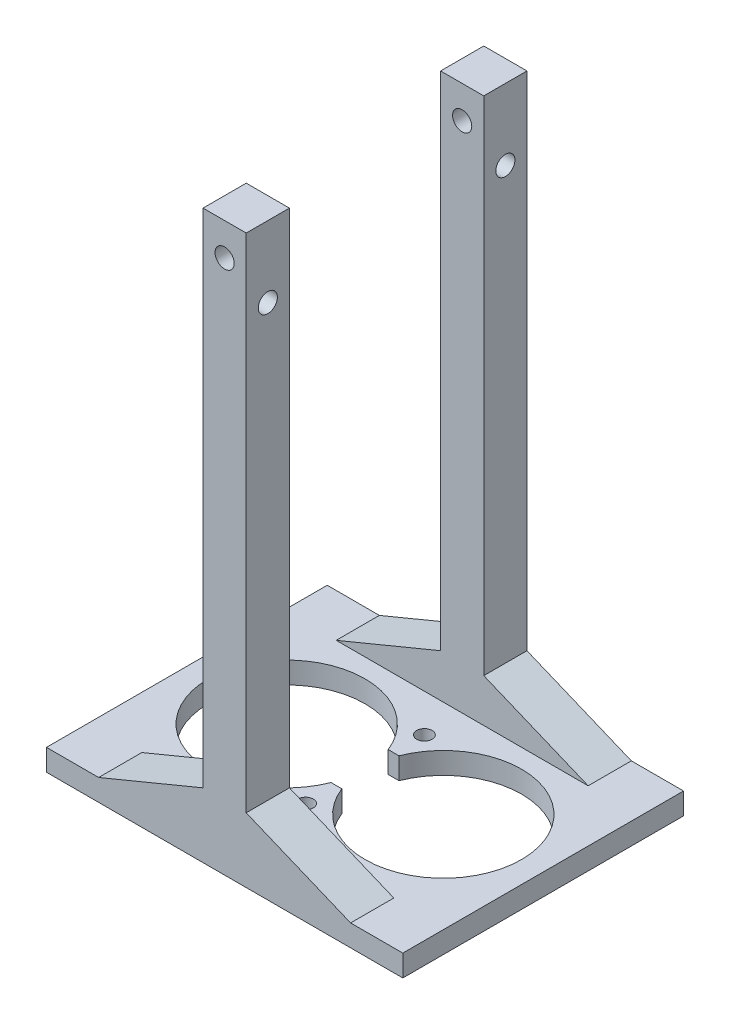
ISO-10303-21;
HEADER;
FILE_DESCRIPTION(('STEP AP214'),'2;1');
FILE_NAME('part.step','',(''),(''),'','','');
FILE_SCHEMA(('AUTOMOTIVE_DESIGN { 1 0 10303 214 1 1 1 1 }'));
ENDSEC;
DATA;
#1=APPLICATION_CONTEXT('core data for automotive mechanical design processes');
#2=APPLICATION_PROTOCOL_DEFINITION('international standard','automotive_design',2000,#1);
#3=PRODUCT_CONTEXT('',#1,'mechanical');
#4=PRODUCT('Part','Part','',(#3));
#5=PRODUCT_RELATED_PRODUCT_CATEGORY('part','',(#4));
#6=PRODUCT_DEFINITION_FORMATION('','',#4);
#7=PRODUCT_DEFINITION_CONTEXT('part definition',#1,'design');
#8=PRODUCT_DEFINITION('design','',#6,#7);
#9=PRODUCT_DEFINITION_SHAPE('','',#8);
#10=(LENGTH_UNIT() NAMED_UNIT(*) SI_UNIT(.MILLI.,.METRE.));
#11=(NAMED_UNIT(*) PLANE_ANGLE_UNIT() SI_UNIT($,.RADIAN.));
#12=(NAMED_UNIT(*) SI_UNIT($,.STERADIAN.) SOLID_ANGLE_UNIT());
#13=UNCERTAINTY_MEASURE_WITH_UNIT(LENGTH_MEASURE(1.E-05),#10,'distance_accuracy_value','');
#14=(GEOMETRIC_REPRESENTATION_CONTEXT(3) GLOBAL_UNCERTAINTY_ASSIGNED_CONTEXT((#13)) GLOBAL_UNIT_ASSIGNED_CONTEXT((#10,
#11,#12)) REPRESENTATION_CONTEXT('',''));
#15=CARTESIAN_POINT('',(0.,0.,0.));
#16=DIRECTION('',(0.,0.,1.));
#17=DIRECTION('',(1.,0.,0.));
#18=AXIS2_PLACEMENT_3D('',#15,#16,#17);
#19=CARTESIAN_POINT('',(-25.9246342106268,105.,-8.44546224874153));
#20=DIRECTION('',(-1.,0.,0.));
#21=DIRECTION('',(0.,0.,1.));
#22=AXIS2_PLACEMENT_3D('',#19,#20,#21);
#23=PLANE('',#22);
#24=CARTESIAN_POINT('',(-25.9246342106268,91.8394942984958,-12.4454622487415));
#25=DIRECTION('',(-1.,0.,0.));
#26=DIRECTION('',(0.,0.,1.));
#27=AXIS2_PLACEMENT_3D('',#24,#25,#26);
#28=CIRCLE('',#27,1.775);
#29=CARTESIAN_POINT('',(-25.9246342106268,91.8394942984958,-10.6704622487415));
#30=VERTEX_POINT('',#29);
#31=EDGE_CURVE('E246',#30,#30,#28,.T.);
#32=ORIENTED_EDGE('',*,*,#31,.F.);
#33=EDGE_LOOP('',(#32));
#34=FACE_BOUND('',#33,.T.);
#35=DIRECTION('',(0.,-1.,0.));
#36=VECTOR('',#35,1.);
#37=CARTESIAN_POINT('',(-25.9246342106268,105.,-16.4454622487415));
#38=LINE('',#37,#36);
#39=CARTESIAN_POINT('',(-25.9246342106268,105.,-16.4454622487415));
#40=VERTEX_POINT('',#39);
#41=CARTESIAN_POINT('',(-25.9246342106268,12.,-16.4454622487415));
#42=VERTEX_POINT('',#41);
#43=EDGE_CURVE('E306',#40,#42,#38,.T.);
#44=ORIENTED_EDGE('',*,*,#43,.T.);
#45=DIRECTION('',(0.,0.,1.));
#46=VECTOR('',#45,1.);
#47=CARTESIAN_POINT('',(-25.9246342106268,12.,-47.830171901692));
#48=LINE('',#47,#46);
#49=CARTESIAN_POINT('',(-25.9246342106268,12.,-8.44546224874153));
#50=VERTEX_POINT('',#49);
#51=EDGE_CURVE('E57',#42,#50,#48,.T.);
#52=ORIENTED_EDGE('',*,*,#51,.T.);
#53=DIRECTION('',(0.,-1.,0.));
#54=VECTOR('',#53,1.);
#55=CARTESIAN_POINT('',(-25.9246342106268,105.,-8.44546224874153));
#56=LINE('',#55,#54);
#57=CARTESIAN_POINT('',(-25.9246342106268,105.,-8.44546224874153));
#58=VERTEX_POINT('',#57);
#59=EDGE_CURVE('E309',#58,#50,#56,.T.);
#60=ORIENTED_EDGE('',*,*,#59,.F.);
#61=DIRECTION('',(0.,0.,-1.));
#62=VECTOR('',#61,1.);
#63=CARTESIAN_POINT('',(-25.9246342106268,105.,-8.44546224874153));
#64=LINE('',#63,#62);
#65=EDGE_CURVE('E294',#58,#40,#64,.T.);
#66=ORIENTED_EDGE('',*,*,#65,.T.);
#67=EDGE_LOOP('',(#44,#52,#60,#66));
#68=FACE_BOUND('',#67,.T.);
#69=ADVANCED_FACE('F34',(#34,#68),#23,.T.);
#70=CARTESIAN_POINT('',(-17.9246342106268,105.,-8.44546224874153));
#71=DIRECTION('',(1.,0.,0.));
#72=DIRECTION('',(0.,0.,-1.));
#73=AXIS2_PLACEMENT_3D('',#70,#71,#72);
#74=PLANE('',#73);
#75=CARTESIAN_POINT('',(-17.9246342106268,91.8394942984958,-12.4454622487415));
#76=DIRECTION('',(1.,0.,0.));
#77=DIRECTION('',(0.,0.,-1.));
#78=AXIS2_PLACEMENT_3D('',#75,#76,#77);
#79=CIRCLE('',#78,1.775);
#80=CARTESIAN_POINT('',(-17.9246342106268,91.8394942984958,-14.2204622487415));
#81=VERTEX_POINT('',#80);
#82=EDGE_CURVE('E234',#81,#81,#79,.T.);
#83=ORIENTED_EDGE('',*,*,#82,.F.);
#84=EDGE_LOOP('',(#83));
#85=FACE_BOUND('',#84,.T.);
#86=DIRECTION('',(0.,-1.,0.));
#87=VECTOR('',#86,1.);
#88=CARTESIAN_POINT('',(-17.9246342106268,105.,-8.44546224874153));
#89=LINE('',#88,#87);
#90=CARTESIAN_POINT('',(-17.9246342106268,105.,-8.44546224874153));
#91=VERTEX_POINT('',#90);
#92=CARTESIAN_POINT('',(-17.9246342106268,12.,-8.44546224874153));
#93=VERTEX_POINT('',#92);
#94=EDGE_CURVE('E312',#91,#93,#89,.T.);
#95=ORIENTED_EDGE('',*,*,#94,.T.);
#96=DIRECTION('',(0.,0.,1.));
#97=VECTOR('',#96,1.);
#98=CARTESIAN_POINT('',(-17.9246342106268,12.,-47.830171901692));
#99=LINE('',#98,#97);
#100=CARTESIAN_POINT('',(-17.9246342106268,12.,-16.4454622487415));
#101=VERTEX_POINT('',#100);
#102=EDGE_CURVE('E188',#101,#93,#99,.T.);
#103=ORIENTED_EDGE('',*,*,#102,.F.);
#104=DIRECTION('',(0.,-1.,0.));
#105=VECTOR('',#104,1.);
#106=CARTESIAN_POINT('',(-17.9246342106268,105.,-16.4454622487415));
#107=LINE('',#106,#105);
#108=CARTESIAN_POINT('',(-17.9246342106268,105.,-16.4454622487415));
#109=VERTEX_POINT('',#108);
#110=EDGE_CURVE('E315',#109,#101,#107,.T.);
#111=ORIENTED_EDGE('',*,*,#110,.F.);
#112=DIRECTION('',(0.,0.,1.));
#113=VECTOR('',#112,1.);
#114=CARTESIAN_POINT('',(-17.9246342106268,105.,-8.44546224874153));
#115=LINE('',#114,#113);
#116=EDGE_CURVE('E300',#109,#91,#115,.T.);
#117=ORIENTED_EDGE('',*,*,#116,.T.);
#118=EDGE_LOOP('',(#95,#103,#111,#117));
#119=FACE_BOUND('',#118,.T.);
#120=ADVANCED_FACE('F396',(#85,#119),#74,.T.);
#121=CARTESIAN_POINT('',(-17.9246342106268,105.,27.5545377512585));
#122=DIRECTION('',(1.,0.,0.));
#123=DIRECTION('',(0.,0.,-1.));
#124=AXIS2_PLACEMENT_3D('',#121,#122,#123);
#125=PLANE('',#124);
#126=CARTESIAN_POINT('',(-17.9246342106268,91.8394942984958,31.5545377512585));
#127=DIRECTION('',(1.,0.,0.));
#128=DIRECTION('',(0.,0.,-1.));
#129=AXIS2_PLACEMENT_3D('',#126,#127,#128);
#130=CIRCLE('',#129,1.775);
#131=CARTESIAN_POINT('',(-17.9246342106268,91.8394942984958,29.7795377512585));
#132=VERTEX_POINT('',#131);
#133=EDGE_CURVE('E249',#132,#132,#130,.T.);
#134=ORIENTED_EDGE('',*,*,#133,.F.);
#135=EDGE_LOOP('',(#134));
#136=FACE_BOUND('',#135,.T.);
#137=DIRECTION('',(0.,-1.,0.));
#138=VECTOR('',#137,1.);
#139=CARTESIAN_POINT('',(-17.9246342106268,105.,35.5545377512585));
#140=LINE('',#139,#138);
#141=CARTESIAN_POINT('',(-17.9246342106268,105.,35.5545377512585));
#142=VERTEX_POINT('',#141);
#143=CARTESIAN_POINT('',(-17.9246342106268,12.,35.5545377512585));
#144=VERTEX_POINT('',#143);
#145=EDGE_CURVE('E287',#142,#144,#140,.T.);
#146=ORIENTED_EDGE('',*,*,#145,.T.);
#147=DIRECTION('',(0.,0.,-1.));
#148=VECTOR('',#147,1.);
#149=CARTESIAN_POINT('',(-17.9246342106268,12.,66.9392474042089));
#150=LINE('',#149,#148);
#151=CARTESIAN_POINT('',(-17.9246342106268,12.,27.5545377512585));
#152=VERTEX_POINT('',#151);
#153=EDGE_CURVE('E213',#144,#152,#150,.T.);
#154=ORIENTED_EDGE('',*,*,#153,.T.);
#155=DIRECTION('',(0.,-1.,0.));
#156=VECTOR('',#155,1.);
#157=CARTESIAN_POINT('',(-17.9246342106268,105.,27.5545377512585));
#158=LINE('',#157,#156);
#159=CARTESIAN_POINT('',(-17.9246342106268,105.,27.5545377512585));
#160=VERTEX_POINT('',#159);
#161=EDGE_CURVE('E289',#160,#152,#158,.T.);
#162=ORIENTED_EDGE('',*,*,#161,.F.);
#163=DIRECTION('',(0.,0.,1.));
#164=VECTOR('',#163,1.);
#165=CARTESIAN_POINT('',(-17.9246342106268,105.,27.5545377512585));
#166=LINE('',#165,#164);
#167=EDGE_CURVE('E274',#160,#142,#166,.T.);
#168=ORIENTED_EDGE('',*,*,#167,.T.);
#169=EDGE_LOOP('',(#146,#154,#162,#168));
#170=FACE_BOUND('',#169,.T.);
#171=ADVANCED_FACE('F402',(#136,#170),#125,.T.);
#172=CARTESIAN_POINT('',(-25.9246342106268,105.,27.5545377512585));
#173=DIRECTION('',(-1.,0.,0.));
#174=DIRECTION('',(0.,0.,1.));
#175=AXIS2_PLACEMENT_3D('',#172,#173,#174);
#176=PLANE('',#175);
#177=CARTESIAN_POINT('',(-25.9246342106268,91.8394942984958,31.5545377512585));
#178=DIRECTION('',(-1.,0.,0.));
#179=DIRECTION('',(0.,0.,1.));
#180=AXIS2_PLACEMENT_3D('',#177,#178,#179);
#181=CIRCLE('',#180,1.775);
#182=CARTESIAN_POINT('',(-25.9246342106268,91.8394942984958,33.3295377512585));
#183=VERTEX_POINT('',#182);
#184=EDGE_CURVE('E252',#183,#183,#181,.T.);
#185=ORIENTED_EDGE('',*,*,#184,.F.);
#186=EDGE_LOOP('',(#185));
#187=FACE_BOUND('',#186,.T.);
#188=DIRECTION('',(0.,-1.,0.));
#189=VECTOR('',#188,1.);
#190=CARTESIAN_POINT('',(-25.9246342106268,105.,27.5545377512585));
#191=LINE('',#190,#189);
#192=CARTESIAN_POINT('',(-25.9246342106268,105.,27.5545377512585));
#193=VERTEX_POINT('',#192);
#194=CARTESIAN_POINT('',(-25.9246342106268,12.,27.5545377512585));
#195=VERTEX_POINT('',#194);
#196=EDGE_CURVE('E280',#193,#195,#191,.T.);
#197=ORIENTED_EDGE('',*,*,#196,.T.);
#198=DIRECTION('',(0.,0.,-1.));
#199=VECTOR('',#198,1.);
#200=CARTESIAN_POINT('',(-25.9246342106268,12.,66.9392474042089));
#201=LINE('',#200,#199);
#202=CARTESIAN_POINT('',(-25.9246342106268,12.,35.5545377512585));
#203=VERTEX_POINT('',#202);
#204=EDGE_CURVE('E217',#203,#195,#201,.T.);
#205=ORIENTED_EDGE('',*,*,#204,.F.);
#206=DIRECTION('',(0.,-1.,0.));
#207=VECTOR('',#206,1.);
#208=CARTESIAN_POINT('',(-25.9246342106268,105.,35.5545377512585));
#209=LINE('',#208,#207);
#210=CARTESIAN_POINT('',(-25.9246342106268,105.,35.5545377512585));
#211=VERTEX_POINT('',#210);
#212=EDGE_CURVE('E283',#211,#203,#209,.T.);
#213=ORIENTED_EDGE('',*,*,#212,.F.);
#214=DIRECTION('',(0.,0.,-1.));
#215=VECTOR('',#214,1.);
#216=CARTESIAN_POINT('',(-25.9246342106268,105.,27.5545377512585));
#217=LINE('',#216,#215);
#218=EDGE_CURVE('E268',#211,#193,#217,.T.);
#219=ORIENTED_EDGE('',*,*,#218,.T.);
#220=EDGE_LOOP('',(#197,#205,#213,#219));
#221=FACE_BOUND('',#220,.T.);
#222=ADVANCED_FACE('F392',(#187,#221),#176,.T.);
#223=CARTESIAN_POINT('',(11.0753657893732,4.,0.));
#224=DIRECTION('',(-1.,0.,0.));
#225=DIRECTION('',(0.,0.,1.));
#226=AXIS2_PLACEMENT_3D('',#223,#224,#225);
#227=PLANE('',#226);
#228=DIRECTION('',(0.,0.,-1.));
#229=VECTOR('',#228,1.);
#230=CARTESIAN_POINT('',(11.0753657893732,0.,0.));
#231=LINE('',#230,#229);
#232=CARTESIAN_POINT('',(11.0753657893732,0.,35.5545377512585));
#233=VERTEX_POINT('',#232);
#234=CARTESIAN_POINT('',(11.0753657893732,0.,-16.4454622487415));
#235=VERTEX_POINT('',#234);
#236=EDGE_CURVE('E362',#233,#235,#231,.T.);
#237=ORIENTED_EDGE('',*,*,#236,.T.);
#238=DIRECTION('',(0.,-1.,0.));
#239=VECTOR('',#238,1.);
#240=CARTESIAN_POINT('',(11.0753657893732,0.,-16.4454622487415));
#241=LINE('',#240,#239);
#242=CARTESIAN_POINT('',(11.0753657893732,4.,-16.4454622487415));
#243=VERTEX_POINT('',#242);
#244=EDGE_CURVE('E206',#243,#235,#241,.T.);
#245=ORIENTED_EDGE('',*,*,#244,.F.);
#246=DIRECTION('',(0.,0.,-1.));
#247=VECTOR('',#246,1.);
#248=CARTESIAN_POINT('',(11.0753657893732,4.,0.));
#249=LINE('',#248,#247);
#250=CARTESIAN_POINT('',(11.0753657893732,4.,35.5545377512585));
#251=VERTEX_POINT('',#250);
#252=EDGE_CURVE('E345',#251,#243,#249,.T.);
#253=ORIENTED_EDGE('',*,*,#252,.F.);
#254=DIRECTION('',(0.,1.,0.));
#255=VECTOR('',#254,1.);
#256=CARTESIAN_POINT('',(11.0753657893732,0.,35.5545377512585));
#257=LINE('',#256,#255);
#258=EDGE_CURVE('E221',#233,#251,#257,.T.);
#259=ORIENTED_EDGE('',*,*,#258,.F.);
#260=EDGE_LOOP('',(#237,#245,#253,#259));
#261=FACE_BOUND('',#260,.T.);
#262=ADVANCED_FACE('F387',(#261),#227,.F.);
#263=CARTESIAN_POINT('',(-7.42463421062682,4.,9.55453775125847));
#264=DIRECTION('',(0.,-1.,0.));
#265=DIRECTION('',(0.,0.,-1.));
#266=AXIS2_PLACEMENT_3D('',#263,#264,#265);
#267=CYLINDRICAL_SURFACE('',#266,14.5);
#268=CARTESIAN_POINT('',(-7.42463421062682,0.,9.55453775125847));
#269=DIRECTION('',(0.,1.,0.));
#270=DIRECTION('',(0.,0.,1.));
#271=AXIS2_PLACEMENT_3D('',#268,#269,#270);
#272=CIRCLE('',#271,14.5);
#273=CARTESIAN_POINT('',(-20.9246342106268,0.,14.8460403733877));
#274=VERTEX_POINT('',#273);
#275=CARTESIAN_POINT('',(-20.9246342106268,0.,4.26303512912929));
#276=VERTEX_POINT('',#275);
#277=EDGE_CURVE('E328',#274,#276,#272,.T.);
#278=ORIENTED_EDGE('',*,*,#277,.F.);
#279=DIRECTION('',(0.,-1.,0.));
#280=VECTOR('',#279,1.);
#281=CARTESIAN_POINT('',(-20.9246342106268,4.,14.8460403733877));
#282=LINE('',#281,#280);
#283=CARTESIAN_POINT('',(-20.9246342106268,4.,14.8460403733877));
#284=VERTEX_POINT('',#283);
#285=EDGE_CURVE('E11',#284,#274,#282,.T.);
#286=ORIENTED_EDGE('',*,*,#285,.F.);
#287=CARTESIAN_POINT('',(-7.42463421062682,4.,9.55453775125847));
#288=DIRECTION('',(0.,1.,0.));
#289=DIRECTION('',(0.,0.,1.));
#290=AXIS2_PLACEMENT_3D('',#287,#288,#289);
#291=CIRCLE('',#290,14.5);
#292=CARTESIAN_POINT('',(-20.9246342106268,4.,4.26303512912929));
#293=VERTEX_POINT('',#292);
#294=EDGE_CURVE('E331',#284,#293,#291,.T.);
#295=ORIENTED_EDGE('',*,*,#294,.T.);
#296=DIRECTION('',(0.,-1.,0.));
#297=VECTOR('',#296,1.);
#298=CARTESIAN_POINT('',(-20.9246342106268,4.,4.26303512912929));
#299=LINE('',#298,#297);
#300=EDGE_CURVE('E350',#293,#276,#299,.T.);
#301=ORIENTED_EDGE('',*,*,#300,.T.);
#302=EDGE_LOOP('',(#278,#286,#295,#301));
#303=FACE_BOUND('',#302,.T.);
#304=ADVANCED_FACE('F36',(#303),#267,.F.);
#305=CARTESIAN_POINT('',(0.,4.,14.8460403733877));
#306=DIRECTION('',(0.,0.,-1.));
#307=DIRECTION('',(-1.,0.,0.));
#308=AXIS2_PLACEMENT_3D('',#305,#306,#307);
#309=PLANE('',#308);
#310=DIRECTION('',(1.,0.,0.));
#311=VECTOR('',#310,1.);
#312=CARTESIAN_POINT('',(0.,0.,14.8460403733877));
#313=LINE('',#312,#311);
#314=CARTESIAN_POINT('',(-22.9246342106268,0.,14.8460403733877));
#315=VERTEX_POINT('',#314);
#316=EDGE_CURVE('E353',#315,#274,#313,.T.);
#317=ORIENTED_EDGE('',*,*,#316,.F.);
#318=DIRECTION('',(0.,-1.,0.));
#319=VECTOR('',#318,1.);
#320=CARTESIAN_POINT('',(-22.9246342106268,4.,14.8460403733877));
#321=LINE('',#320,#319);
#322=CARTESIAN_POINT('',(-22.9246342106268,4.,14.8460403733877));
#323=VERTEX_POINT('',#322);
#324=EDGE_CURVE('E42',#323,#315,#321,.T.);
#325=ORIENTED_EDGE('',*,*,#324,.F.);
#326=DIRECTION('',(1.,0.,0.));
#327=VECTOR('',#326,1.);
#328=CARTESIAN_POINT('',(0.,4.,14.8460403733877));
#329=LINE('',#328,#327);
#330=EDGE_CURVE('E334',#323,#284,#329,.T.);
#331=ORIENTED_EDGE('',*,*,#330,.T.);
#332=ORIENTED_EDGE('',*,*,#285,.T.);
#333=EDGE_LOOP('',(#317,#325,#331,#332));
#334=FACE_BOUND('',#333,.T.);
#335=ADVANCED_FACE('F374',(#334),#309,.T.);
#336=CARTESIAN_POINT('',(-36.4246342106268,4.,9.55453775125847));
#337=DIRECTION('',(0.,-1.,0.));
#338=DIRECTION('',(0.,0.,-1.));
#339=AXIS2_PLACEMENT_3D('',#336,#337,#338);
#340=CYLINDRICAL_SURFACE('',#339,14.5);
#341=CARTESIAN_POINT('',(-36.4246342106268,0.,9.55453775125847));
#342=DIRECTION('',(0.,1.,0.));
#343=DIRECTION('',(0.,0.,1.));
#344=AXIS2_PLACEMENT_3D('',#341,#342,#343);
#345=CIRCLE('',#344,14.5);
#346=CARTESIAN_POINT('',(-22.9246342106268,0.,4.26303512912929));
#347=VERTEX_POINT('',#346);
#348=EDGE_CURVE('E356',#347,#315,#345,.T.);
#349=ORIENTED_EDGE('',*,*,#348,.F.);
#350=DIRECTION('',(0.,-1.,0.));
#351=VECTOR('',#350,1.);
#352=CARTESIAN_POINT('',(-22.9246342106268,4.,4.26303512912929));
#353=LINE('',#352,#351);
#354=CARTESIAN_POINT('',(-22.9246342106268,4.,4.26303512912929));
#355=VERTEX_POINT('',#354);
#356=EDGE_CURVE('E366',#355,#347,#353,.T.);
#357=ORIENTED_EDGE('',*,*,#356,.F.);
#358=CARTESIAN_POINT('',(-36.4246342106268,4.,9.55453775125847));
#359=DIRECTION('',(0.,1.,0.));
#360=DIRECTION('',(0.,0.,1.));
#361=AXIS2_PLACEMENT_3D('',#358,#359,#360);
#362=CIRCLE('',#361,14.5);
#363=EDGE_CURVE('E338',#355,#323,#362,.T.);
#364=ORIENTED_EDGE('',*,*,#363,.T.);
#365=ORIENTED_EDGE('',*,*,#324,.T.);
#366=EDGE_LOOP('',(#349,#357,#364,#365));
#367=FACE_BOUND('',#366,.T.);
#368=ADVANCED_FACE('F370',(#367),#340,.F.);
#369=CARTESIAN_POINT('',(0.,4.,4.26303512912929));
#370=DIRECTION('',(0.,0.,-1.));
#371=DIRECTION('',(-1.,0.,0.));
#372=AXIS2_PLACEMENT_3D('',#369,#370,#371);
#373=PLANE('',#372);
#374=DIRECTION('',(1.,0.,0.));
#375=VECTOR('',#374,1.);
#376=CARTESIAN_POINT('',(0.,0.,4.26303512912929));
#377=LINE('',#376,#375);
#378=EDGE_CURVE('E359',#347,#276,#377,.T.);
#379=ORIENTED_EDGE('',*,*,#378,.T.);
#380=ORIENTED_EDGE('',*,*,#300,.F.);
#381=DIRECTION('',(1.,0.,0.));
#382=VECTOR('',#381,1.);
#383=CARTESIAN_POINT('',(0.,4.,4.26303512912929));
#384=LINE('',#383,#382);
#385=EDGE_CURVE('E341',#355,#293,#384,.T.);
#386=ORIENTED_EDGE('',*,*,#385,.F.);
#387=ORIENTED_EDGE('',*,*,#356,.T.);
#388=EDGE_LOOP('',(#379,#380,#386,#387));
#389=FACE_BOUND('',#388,.T.);
#390=ADVANCED_FACE('F381',(#389),#373,.F.);
#391=CARTESIAN_POINT('',(-54.9246342106268,4.,0.));
#392=DIRECTION('',(1.,0.,0.));
#393=DIRECTION('',(0.,0.,-1.));
#394=AXIS2_PLACEMENT_3D('',#391,#392,#393);
#395=PLANE('',#394);
#396=DIRECTION('',(0.,0.,1.));
#397=VECTOR('',#396,1.);
#398=CARTESIAN_POINT('',(-54.9246342106268,0.,0.));
#399=LINE('',#398,#397);
#400=CARTESIAN_POINT('',(-54.9246342106268,0.,-16.4454622487415));
#401=VERTEX_POINT('',#400);
#402=CARTESIAN_POINT('',(-54.9246342106268,0.,35.5545377512585));
#403=VERTEX_POINT('',#402);
#404=EDGE_CURVE('E335',#401,#403,#399,.T.);
#405=ORIENTED_EDGE('',*,*,#404,.T.);
#406=DIRECTION('',(0.,-1.,0.));
#407=VECTOR('',#406,1.);
#408=CARTESIAN_POINT('',(-54.9246342106268,0.,35.5545377512585));
#409=LINE('',#408,#407);
#410=CARTESIAN_POINT('',(-54.9246342106268,4.,35.5545377512585));
#411=VERTEX_POINT('',#410);
#412=EDGE_CURVE('E235',#411,#403,#409,.T.);
#413=ORIENTED_EDGE('',*,*,#412,.F.);
#414=DIRECTION('',(0.,0.,1.));
#415=VECTOR('',#414,1.);
#416=CARTESIAN_POINT('',(-54.9246342106268,4.,0.));
#417=LINE('',#416,#415);
#418=CARTESIAN_POINT('',(-54.9246342106268,4.,-16.4454622487415));
#419=VERTEX_POINT('',#418);
#420=EDGE_CURVE('E348',#419,#411,#417,.T.);
#421=ORIENTED_EDGE('',*,*,#420,.F.);
#422=DIRECTION('',(0.,1.,0.));
#423=VECTOR('',#422,1.);
#424=CARTESIAN_POINT('',(-54.9246342106268,4.,-16.4454622487415));
#425=LINE('',#424,#423);
#426=EDGE_CURVE('E183',#401,#419,#425,.T.);
#427=ORIENTED_EDGE('',*,*,#426,.F.);
#428=EDGE_LOOP('',(#405,#413,#421,#427));
#429=FACE_BOUND('',#428,.T.);
#430=ADVANCED_FACE('F419',(#429),#395,.F.);
#431=CARTESIAN_POINT('',(0.,4.,0.));
#432=DIRECTION('',(0.,1.,0.));
#433=DIRECTION('',(0.,0.,1.));
#434=AXIS2_PLACEMENT_3D('',#431,#432,#433);
#435=PLANE('',#434);
#436=CARTESIAN_POINT('',(-21.9246342106268,4.,20.5545377512585));
#437=DIRECTION('',(0.,-1.,0.));
#438=DIRECTION('',(0.,0.,-1.));
#439=AXIS2_PLACEMENT_3D('',#436,#437,#438);
#440=CIRCLE('',#439,1.42724169553592);
#441=CARTESIAN_POINT('',(-21.9246342106268,4.,19.1272960557225));
#442=VERTEX_POINT('',#441);
#443=EDGE_CURVE('E319',#442,#442,#440,.T.);
#444=ORIENTED_EDGE('',*,*,#443,.T.);
#445=EDGE_LOOP('',(#444));
#446=FACE_BOUND('',#445,.T.);
#447=CARTESIAN_POINT('',(-21.9246342106268,4.,-1.44546224874153));
#448=DIRECTION('',(0.,-1.,0.));
#449=DIRECTION('',(0.,0.,-1.));
#450=AXIS2_PLACEMENT_3D('',#447,#448,#449);
#451=CIRCLE('',#450,1.42724169553591);
#452=CARTESIAN_POINT('',(-21.9246342106268,4.,-2.87270394427744));
#453=VERTEX_POINT('',#452);
#454=EDGE_CURVE('E325',#453,#453,#451,.T.);
#455=ORIENTED_EDGE('',*,*,#454,.T.);
#456=EDGE_LOOP('',(#455));
#457=FACE_BOUND('',#456,.T.);
#458=ORIENTED_EDGE('',*,*,#294,.F.);
#459=ORIENTED_EDGE('',*,*,#330,.F.);
#460=ORIENTED_EDGE('',*,*,#363,.F.);
#461=ORIENTED_EDGE('',*,*,#385,.T.);
#462=EDGE_LOOP('',(#458,#459,#460,#461));
#463=FACE_BOUND('',#462,.T.);
#464=ORIENTED_EDGE('',*,*,#420,.T.);
#465=DIRECTION('',(-1.,0.,0.));
#466=VECTOR('',#465,1.);
#467=CARTESIAN_POINT('',(-54.9246342106268,4.,35.5545377512585));
#468=LINE('',#467,#466);
#469=CARTESIAN_POINT('',(-45.2579675439601,4.,35.5545377512585));
#470=VERTEX_POINT('',#469);
#471=EDGE_CURVE('E238',#470,#411,#468,.T.);
#472=ORIENTED_EDGE('',*,*,#471,.F.);
#473=DIRECTION('',(0.,0.,-1.));
#474=VECTOR('',#473,1.);
#475=CARTESIAN_POINT('',(-45.2579675439601,4.,66.9392474042089));
#476=LINE('',#475,#474);
#477=CARTESIAN_POINT('',(-45.2579675439601,4.,27.5545377512585));
#478=VERTEX_POINT('',#477);
#479=EDGE_CURVE('E230',#470,#478,#476,.T.);
#480=ORIENTED_EDGE('',*,*,#479,.T.);
#481=DIRECTION('',(1.,0.,0.));
#482=VECTOR('',#481,1.);
#483=CARTESIAN_POINT('',(0.,4.,27.5545377512585));
#484=LINE('',#483,#482);
#485=CARTESIAN_POINT('',(1.40869912270651,4.,27.5545377512585));
#486=VERTEX_POINT('',#485);
#487=EDGE_CURVE('E343',#478,#486,#484,.T.);
#488=ORIENTED_EDGE('',*,*,#487,.T.);
#489=DIRECTION('',(0.,0.,-1.));
#490=VECTOR('',#489,1.);
#491=CARTESIAN_POINT('',(1.40869912270652,4.,66.9392474042089));
#492=LINE('',#491,#490);
#493=CARTESIAN_POINT('',(1.40869912270652,4.,35.5545377512585));
#494=VERTEX_POINT('',#493);
#495=EDGE_CURVE('E202',#494,#486,#492,.T.);
#496=ORIENTED_EDGE('',*,*,#495,.F.);
#497=DIRECTION('',(-1.,0.,0.));
#498=VECTOR('',#497,1.);
#499=CARTESIAN_POINT('',(11.0753657893732,4.,35.5545377512585));
#500=LINE('',#499,#498);
#501=EDGE_CURVE('E218',#251,#494,#500,.T.);
#502=ORIENTED_EDGE('',*,*,#501,.F.);
#503=ORIENTED_EDGE('',*,*,#252,.T.);
#504=DIRECTION('',(1.,0.,0.));
#505=VECTOR('',#504,1.);
#506=CARTESIAN_POINT('',(11.0753657893732,4.,-16.4454622487415));
#507=LINE('',#506,#505);
#508=CARTESIAN_POINT('',(1.40869912270651,4.,-16.4454622487415));
#509=VERTEX_POINT('',#508);
#510=EDGE_CURVE('E199',#509,#243,#507,.T.);
#511=ORIENTED_EDGE('',*,*,#510,.F.);
#512=DIRECTION('',(0.,0.,1.));
#513=VECTOR('',#512,1.);
#514=CARTESIAN_POINT('',(1.40869912270651,4.,-47.830171901692));
#515=LINE('',#514,#513);
#516=CARTESIAN_POINT('',(1.40869912270651,4.,-8.44546224874153));
#517=VERTEX_POINT('',#516);
#518=EDGE_CURVE('E198',#509,#517,#515,.T.);
#519=ORIENTED_EDGE('',*,*,#518,.T.);
#520=DIRECTION('',(1.,0.,0.));
#521=VECTOR('',#520,1.);
#522=CARTESIAN_POINT('',(0.,4.,-8.44546224874153));
#523=LINE('',#522,#521);
#524=CARTESIAN_POINT('',(-45.2579675439601,4.,-8.44546224874153));
#525=VERTEX_POINT('',#524);
#526=EDGE_CURVE('E49',#525,#517,#523,.T.);
#527=ORIENTED_EDGE('',*,*,#526,.F.);
#528=DIRECTION('',(0.,0.,1.));
#529=VECTOR('',#528,1.);
#530=CARTESIAN_POINT('',(-45.2579675439601,4.,-47.830171901692));
#531=LINE('',#530,#529);
#532=CARTESIAN_POINT('',(-45.2579675439601,4.,-16.4454622487415));
#533=VERTEX_POINT('',#532);
#534=EDGE_CURVE('E168',#533,#525,#531,.T.);
#535=ORIENTED_EDGE('',*,*,#534,.F.);
#536=DIRECTION('',(1.,0.,0.));
#537=VECTOR('',#536,1.);
#538=CARTESIAN_POINT('',(-45.2579675439601,4.,-16.4454622487415));
#539=LINE('',#538,#537);
#540=EDGE_CURVE('E172',#419,#533,#539,.T.);
#541=ORIENTED_EDGE('',*,*,#540,.F.);
#542=EDGE_LOOP('',(#464,#472,#480,#488,#496,#502,#503,#511,#519,#527,#535,#541));
#543=FACE_BOUND('',#542,.T.);
#544=ADVANCED_FACE('F170',(#446,#457,#463,#543),#435,.T.);
#545=CARTESIAN_POINT('',(0.,0.,0.));
#546=DIRECTION('',(0.,1.,0.));
#547=DIRECTION('',(0.,0.,1.));
#548=AXIS2_PLACEMENT_3D('',#545,#546,#547);
#549=PLANE('',#548);
#550=DIRECTION('',(1.,0.,0.));
#551=VECTOR('',#550,1.);
#552=CARTESIAN_POINT('',(-25.9246342106268,0.,-16.4454622487415));
#553=LINE('',#552,#551);
#554=EDGE_CURVE('E286',#401,#235,#553,.T.);
#555=ORIENTED_EDGE('',*,*,#554,.T.);
#556=ORIENTED_EDGE('',*,*,#236,.F.);
#557=DIRECTION('',(-1.,0.,0.));
#558=VECTOR('',#557,1.);
#559=CARTESIAN_POINT('',(-25.9246342106268,0.,35.5545377512585));
#560=LINE('',#559,#558);
#561=EDGE_CURVE('E267',#233,#403,#560,.T.);
#562=ORIENTED_EDGE('',*,*,#561,.T.);
#563=ORIENTED_EDGE('',*,*,#404,.F.);
#564=EDGE_LOOP('',(#555,#556,#562,#563));
#565=FACE_BOUND('',#564,.T.);
#566=CARTESIAN_POINT('',(-21.9246342106268,0.,20.5545377512585));
#567=DIRECTION('',(0.,-1.,0.));
#568=DIRECTION('',(0.,0.,-1.));
#569=AXIS2_PLACEMENT_3D('',#566,#567,#568);
#570=CIRCLE('',#569,1.42724169553592);
#571=CARTESIAN_POINT('',(-21.9246342106268,0.,19.1272960557225));
#572=VERTEX_POINT('',#571);
#573=EDGE_CURVE('E311',#572,#572,#570,.T.);
#574=ORIENTED_EDGE('',*,*,#573,.F.);
#575=EDGE_LOOP('',(#574));
#576=FACE_BOUND('',#575,.T.);
#577=CARTESIAN_POINT('',(-21.9246342106268,0.,-1.44546224874153));
#578=DIRECTION('',(0.,-1.,0.));
#579=DIRECTION('',(0.,0.,-1.));
#580=AXIS2_PLACEMENT_3D('',#577,#578,#579);
#581=CIRCLE('',#580,1.42724169553591);
#582=CARTESIAN_POINT('',(-21.9246342106268,0.,-2.87270394427744));
#583=VERTEX_POINT('',#582);
#584=EDGE_CURVE('E322',#583,#583,#581,.T.);
#585=ORIENTED_EDGE('',*,*,#584,.F.);
#586=EDGE_LOOP('',(#585));
#587=FACE_BOUND('',#586,.T.);
#588=ORIENTED_EDGE('',*,*,#277,.T.);
#589=ORIENTED_EDGE('',*,*,#378,.F.);
#590=ORIENTED_EDGE('',*,*,#348,.T.);
#591=ORIENTED_EDGE('',*,*,#316,.T.);
#592=EDGE_LOOP('',(#588,#589,#590,#591));
#593=FACE_BOUND('',#592,.T.);
#594=ADVANCED_FACE('F378',(#565,#576,#587,#593),#549,.F.);
#595=CARTESIAN_POINT('',(-21.9246342106268,4.,-1.44546224874153));
#596=DIRECTION('',(0.,-1.,0.));
#597=DIRECTION('',(0.,0.,-1.));
#598=AXIS2_PLACEMENT_3D('',#595,#596,#597);
#599=CYLINDRICAL_SURFACE('',#598,1.42724169553591);
#600=ORIENTED_EDGE('',*,*,#454,.F.);
#601=EDGE_LOOP('',(#600));
#602=FACE_BOUND('',#601,.T.);
#603=ORIENTED_EDGE('',*,*,#584,.T.);
#604=EDGE_LOOP('',(#603));
#605=FACE_BOUND('',#604,.T.);
#606=ADVANCED_FACE('F412',(#602,#605),#599,.F.);
#607=CARTESIAN_POINT('',(-21.9246342106268,4.,20.5545377512585));
#608=DIRECTION('',(0.,-1.,0.));
#609=DIRECTION('',(0.,0.,-1.));
#610=AXIS2_PLACEMENT_3D('',#607,#608,#609);
#611=CYLINDRICAL_SURFACE('',#610,1.42724169553592);
#612=ORIENTED_EDGE('',*,*,#443,.F.);
#613=EDGE_LOOP('',(#612));
#614=FACE_BOUND('',#613,.T.);
#615=ORIENTED_EDGE('',*,*,#573,.T.);
#616=EDGE_LOOP('',(#615));
#617=FACE_BOUND('',#616,.T.);
#618=ADVANCED_FACE('F408',(#614,#617),#611,.F.);
#619=CARTESIAN_POINT('',(-25.9246342106268,105.,-8.44546224874153));
#620=DIRECTION('',(0.,0.,1.));
#621=DIRECTION('',(1.,0.,0.));
#622=AXIS2_PLACEMENT_3D('',#619,#620,#621);
#623=PLANE('',#622);
#624=CARTESIAN_POINT('',(-21.9246342106268,99.,-8.44546224874153));
#625=DIRECTION('',(0.,0.,1.));
#626=DIRECTION('',(1.,0.,0.));
#627=AXIS2_PLACEMENT_3D('',#624,#625,#626);
#628=CIRCLE('',#627,1.775);
#629=CARTESIAN_POINT('',(-20.1496342106268,99.,-8.44546224874153));
#630=VERTEX_POINT('',#629);
#631=EDGE_CURVE('E264',#630,#630,#628,.T.);
#632=ORIENTED_EDGE('',*,*,#631,.F.);
#633=EDGE_LOOP('',(#632));
#634=FACE_BOUND('',#633,.T.);
#635=ORIENTED_EDGE('',*,*,#59,.T.);
#636=DIRECTION('',(0.924016832421891,0.3823517927263,0.));
#637=VECTOR('',#636,1.);
#638=CARTESIAN_POINT('',(-25.9246342106268,12.,-8.44546224874153));
#639=LINE('',#638,#637);
#640=EDGE_CURVE('E177',#525,#50,#639,.T.);
#641=ORIENTED_EDGE('',*,*,#640,.F.);
#642=ORIENTED_EDGE('',*,*,#526,.T.);
#643=DIRECTION('',(0.924016832421891,-0.382351792726299,0.));
#644=VECTOR('',#643,1.);
#645=CARTESIAN_POINT('',(1.40869912270651,4.,-8.44546224874153));
#646=LINE('',#645,#644);
#647=EDGE_CURVE('E190',#93,#517,#646,.T.);
#648=ORIENTED_EDGE('',*,*,#647,.F.);
#649=ORIENTED_EDGE('',*,*,#94,.F.);
#650=DIRECTION('',(-1.,0.,0.));
#651=VECTOR('',#650,1.);
#652=CARTESIAN_POINT('',(-25.9246342106268,105.,-8.44546224874153));
#653=LINE('',#652,#651);
#654=EDGE_CURVE('E303',#91,#58,#653,.T.);
#655=ORIENTED_EDGE('',*,*,#654,.T.);
#656=EDGE_LOOP('',(#635,#641,#642,#648,#649,#655));
#657=FACE_BOUND('',#656,.T.);
#658=ADVANCED_FACE('F411',(#634,#657),#623,.T.);
#659=CARTESIAN_POINT('',(-25.9246342106268,105.,-16.4454622487415));
#660=DIRECTION('',(0.,0.,-1.));
#661=DIRECTION('',(-1.,0.,0.));
#662=AXIS2_PLACEMENT_3D('',#659,#660,#661);
#663=PLANE('',#662);
#664=CARTESIAN_POINT('',(-21.9246342106268,99.,-16.4454622487415));
#665=DIRECTION('',(0.,0.,-1.));
#666=DIRECTION('',(-1.,0.,0.));
#667=AXIS2_PLACEMENT_3D('',#664,#665,#666);
#668=CIRCLE('',#667,1.775);
#669=CARTESIAN_POINT('',(-23.6996342106268,99.,-16.4454622487415));
#670=VERTEX_POINT('',#669);
#671=EDGE_CURVE('E258',#670,#670,#668,.F.);
#672=ORIENTED_EDGE('',*,*,#671,.T.);
#673=EDGE_LOOP('',(#672));
#674=FACE_BOUND('',#673,.T.);
#675=ORIENTED_EDGE('',*,*,#554,.F.);
#676=ORIENTED_EDGE('',*,*,#426,.T.);
#677=ORIENTED_EDGE('',*,*,#540,.T.);
#678=DIRECTION('',(0.924016832421891,0.3823517927263,0.));
#679=VECTOR('',#678,1.);
#680=CARTESIAN_POINT('',(-25.9246342106268,12.,-16.4454622487415));
#681=LINE('',#680,#679);
#682=EDGE_CURVE('E180',#533,#42,#681,.T.);
#683=ORIENTED_EDGE('',*,*,#682,.T.);
#684=ORIENTED_EDGE('',*,*,#43,.F.);
#685=DIRECTION('',(1.,0.,0.));
#686=VECTOR('',#685,1.);
#687=CARTESIAN_POINT('',(-25.9246342106268,105.,-16.4454622487415));
#688=LINE('',#687,#686);
#689=EDGE_CURVE('E297',#40,#109,#688,.T.);
#690=ORIENTED_EDGE('',*,*,#689,.T.);
#691=ORIENTED_EDGE('',*,*,#110,.T.);
#692=DIRECTION('',(0.924016832421891,-0.382351792726299,0.));
#693=VECTOR('',#692,1.);
#694=CARTESIAN_POINT('',(1.40869912270651,4.,-16.4454622487415));
#695=LINE('',#694,#693);
#696=EDGE_CURVE('E203',#101,#509,#695,.T.);
#697=ORIENTED_EDGE('',*,*,#696,.T.);
#698=ORIENTED_EDGE('',*,*,#510,.T.);
#699=ORIENTED_EDGE('',*,*,#244,.T.);
#700=EDGE_LOOP('',(#675,#676,#677,#683,#684,#690,#691,#697,#698,#699));
#701=FACE_BOUND('',#700,.T.);
#702=ADVANCED_FACE('F186',(#674,#701),#663,.T.);
#703=CARTESIAN_POINT('',(0.,105.,0.));
#704=DIRECTION('',(0.,-1.,0.));
#705=DIRECTION('',(0.,0.,-1.));
#706=AXIS2_PLACEMENT_3D('',#703,#704,#705);
#707=PLANE('',#706);
#708=ORIENTED_EDGE('',*,*,#65,.F.);
#709=ORIENTED_EDGE('',*,*,#654,.F.);
#710=ORIENTED_EDGE('',*,*,#116,.F.);
#711=ORIENTED_EDGE('',*,*,#689,.F.);
#712=EDGE_LOOP('',(#708,#709,#710,#711));
#713=FACE_BOUND('',#712,.T.);
#714=ADVANCED_FACE('F473',(#713),#707,.F.);
#715=CARTESIAN_POINT('',(-25.9246342106268,105.,27.5545377512585));
#716=DIRECTION('',(0.,0.,-1.));
#717=DIRECTION('',(-1.,0.,0.));
#718=AXIS2_PLACEMENT_3D('',#715,#716,#717);
#719=PLANE('',#718);
#720=CARTESIAN_POINT('',(-21.9246342106268,99.,27.5545377512585));
#721=DIRECTION('',(0.,0.,-1.));
#722=DIRECTION('',(-1.,0.,0.));
#723=AXIS2_PLACEMENT_3D('',#720,#721,#722);
#724=CIRCLE('',#723,1.775);
#725=CARTESIAN_POINT('',(-23.6996342106268,99.,27.5545377512585));
#726=VERTEX_POINT('',#725);
#727=EDGE_CURVE('E261',#726,#726,#724,.T.);
#728=ORIENTED_EDGE('',*,*,#727,.F.);
#729=EDGE_LOOP('',(#728));
#730=FACE_BOUND('',#729,.T.);
#731=ORIENTED_EDGE('',*,*,#487,.F.);
#732=DIRECTION('',(-0.924016832421891,-0.3823517927263,0.));
#733=VECTOR('',#732,1.);
#734=CARTESIAN_POINT('',(-45.2579675439601,4.,27.5545377512585));
#735=LINE('',#734,#733);
#736=EDGE_CURVE('E227',#195,#478,#735,.T.);
#737=ORIENTED_EDGE('',*,*,#736,.F.);
#738=ORIENTED_EDGE('',*,*,#196,.F.);
#739=DIRECTION('',(1.,0.,0.));
#740=VECTOR('',#739,1.);
#741=CARTESIAN_POINT('',(-25.9246342106268,105.,27.5545377512585));
#742=LINE('',#741,#740);
#743=EDGE_CURVE('E271',#193,#160,#742,.T.);
#744=ORIENTED_EDGE('',*,*,#743,.T.);
#745=ORIENTED_EDGE('',*,*,#161,.T.);
#746=DIRECTION('',(-0.924016832421891,0.3823517927263,0.));
#747=VECTOR('',#746,1.);
#748=CARTESIAN_POINT('',(-17.9246342106268,12.,27.5545377512585));
#749=LINE('',#748,#747);
#750=EDGE_CURVE('E210',#486,#152,#749,.T.);
#751=ORIENTED_EDGE('',*,*,#750,.F.);
#752=EDGE_LOOP('',(#731,#737,#738,#744,#745,#751));
#753=FACE_BOUND('',#752,.T.);
#754=ADVANCED_FACE('F480',(#730,#753),#719,.T.);
#755=CARTESIAN_POINT('',(-25.9246342106268,105.,35.5545377512585));
#756=DIRECTION('',(0.,0.,1.));
#757=DIRECTION('',(1.,0.,0.));
#758=AXIS2_PLACEMENT_3D('',#755,#756,#757);
#759=PLANE('',#758);
#760=CARTESIAN_POINT('',(-21.9246342106268,99.,35.5545377512585));
#761=DIRECTION('',(0.,0.,1.));
#762=DIRECTION('',(1.,0.,0.));
#763=AXIS2_PLACEMENT_3D('',#760,#761,#762);
#764=CIRCLE('',#763,1.775);
#765=CARTESIAN_POINT('',(-20.1496342106268,99.,35.5545377512585));
#766=VERTEX_POINT('',#765);
#767=EDGE_CURVE('E255',#766,#766,#764,.T.);
#768=ORIENTED_EDGE('',*,*,#767,.F.);
#769=EDGE_LOOP('',(#768));
#770=FACE_BOUND('',#769,.T.);
#771=ORIENTED_EDGE('',*,*,#561,.F.);
#772=ORIENTED_EDGE('',*,*,#258,.T.);
#773=ORIENTED_EDGE('',*,*,#501,.T.);
#774=DIRECTION('',(-0.924016832421891,0.3823517927263,0.));
#775=VECTOR('',#774,1.);
#776=CARTESIAN_POINT('',(-17.9246342106268,12.,35.5545377512585));
#777=LINE('',#776,#775);
#778=EDGE_CURVE('E214',#494,#144,#777,.T.);
#779=ORIENTED_EDGE('',*,*,#778,.T.);
#780=ORIENTED_EDGE('',*,*,#145,.F.);
#781=DIRECTION('',(-1.,0.,0.));
#782=VECTOR('',#781,1.);
#783=CARTESIAN_POINT('',(-25.9246342106268,105.,35.5545377512585));
#784=LINE('',#783,#782);
#785=EDGE_CURVE('E277',#142,#211,#784,.T.);
#786=ORIENTED_EDGE('',*,*,#785,.T.);
#787=ORIENTED_EDGE('',*,*,#212,.T.);
#788=DIRECTION('',(-0.924016832421891,-0.3823517927263,0.));
#789=VECTOR('',#788,1.);
#790=CARTESIAN_POINT('',(-45.2579675439601,4.,35.5545377512585));
#791=LINE('',#790,#789);
#792=EDGE_CURVE('E231',#203,#470,#791,.T.);
#793=ORIENTED_EDGE('',*,*,#792,.T.);
#794=ORIENTED_EDGE('',*,*,#471,.T.);
#795=ORIENTED_EDGE('',*,*,#412,.T.);
#796=EDGE_LOOP('',(#771,#772,#773,#779,#780,#786,#787,#793,#794,#795));
#797=FACE_BOUND('',#796,.T.);
#798=ADVANCED_FACE('F489',(#770,#797),#759,.T.);
#799=CARTESIAN_POINT('',(0.,105.,0.));
#800=DIRECTION('',(0.,1.,0.));
#801=DIRECTION('',(0.,0.,1.));
#802=AXIS2_PLACEMENT_3D('',#799,#800,#801);
#803=PLANE('',#802);
#804=ORIENTED_EDGE('',*,*,#218,.F.);
#805=ORIENTED_EDGE('',*,*,#785,.F.);
#806=ORIENTED_EDGE('',*,*,#167,.F.);
#807=ORIENTED_EDGE('',*,*,#743,.F.);
#808=EDGE_LOOP('',(#804,#805,#806,#807));
#809=FACE_BOUND('',#808,.T.);
#810=ADVANCED_FACE('F498',(#809),#803,.T.);
#811=CARTESIAN_POINT('',(-21.9246342106268,99.,-21.465920395166));
#812=DIRECTION('',(0.,0.,1.));
#813=DIRECTION('',(1.,0.,0.));
#814=AXIS2_PLACEMENT_3D('',#811,#812,#813);
#815=CYLINDRICAL_SURFACE('',#814,1.775);
#816=ORIENTED_EDGE('',*,*,#727,.T.);
#817=EDGE_LOOP('',(#816));
#818=FACE_BOUND('',#817,.T.);
#819=ORIENTED_EDGE('',*,*,#767,.T.);
#820=EDGE_LOOP('',(#819));
#821=FACE_BOUND('',#820,.T.);
#822=ADVANCED_FACE('F506',(#818,#821),#815,.F.);
#823=ORIENTED_EDGE('',*,*,#631,.T.);
#824=EDGE_LOOP('',(#823));
#825=FACE_BOUND('',#824,.T.);
#826=ORIENTED_EDGE('',*,*,#671,.F.);
#827=EDGE_LOOP('',(#826));
#828=FACE_BOUND('',#827,.T.);
#829=ADVANCED_FACE('F514',(#825,#828),#815,.F.);
#830=CARTESIAN_POINT('',(-54.9246592106268,91.8394942984958,31.5545377512585));
#831=DIRECTION('',(1.,0.,0.));
#832=DIRECTION('',(0.,0.,-1.));
#833=AXIS2_PLACEMENT_3D('',#830,#831,#832);
#834=CYLINDRICAL_SURFACE('',#833,1.775);
#835=ORIENTED_EDGE('',*,*,#184,.T.);
#836=EDGE_LOOP('',(#835));
#837=FACE_BOUND('',#836,.T.);
#838=ORIENTED_EDGE('',*,*,#133,.T.);
#839=EDGE_LOOP('',(#838));
#840=FACE_BOUND('',#839,.T.);
#841=ADVANCED_FACE('F522',(#837,#840),#834,.F.);
#842=CARTESIAN_POINT('',(-54.9246592106268,91.8394942984958,-12.4454622487415));
#843=DIRECTION('',(1.,0.,0.));
#844=DIRECTION('',(0.,0.,-1.));
#845=AXIS2_PLACEMENT_3D('',#842,#843,#844);
#846=CYLINDRICAL_SURFACE('',#845,1.775);
#847=ORIENTED_EDGE('',*,*,#31,.T.);
#848=EDGE_LOOP('',(#847));
#849=FACE_BOUND('',#848,.T.);
#850=ORIENTED_EDGE('',*,*,#82,.T.);
#851=EDGE_LOOP('',(#850));
#852=FACE_BOUND('',#851,.T.);
#853=ADVANCED_FACE('F529',(#849,#852),#846,.F.);
#854=CARTESIAN_POINT('',(-45.2579675439601,4.,66.9392474042089));
#855=DIRECTION('',(0.3823517927263,-0.924016832421891,0.));
#856=DIRECTION('',(0.924016832421891,0.3823517927263,0.));
#857=AXIS2_PLACEMENT_3D('',#854,#855,#856);
#858=PLANE('',#857);
#859=ORIENTED_EDGE('',*,*,#792,.F.);
#860=ORIENTED_EDGE('',*,*,#204,.T.);
#861=ORIENTED_EDGE('',*,*,#736,.T.);
#862=ORIENTED_EDGE('',*,*,#479,.F.);
#863=EDGE_LOOP('',(#859,#860,#861,#862));
#864=FACE_BOUND('',#863,.T.);
#865=ADVANCED_FACE('F537',(#864),#858,.F.);
#866=CARTESIAN_POINT('',(-17.9246342106268,12.,66.9392474042089));
#867=DIRECTION('',(-0.3823517927263,-0.924016832421891,0.));
#868=DIRECTION('',(0.924016832421891,-0.3823517927263,0.));
#869=AXIS2_PLACEMENT_3D('',#866,#867,#868);
#870=PLANE('',#869);
#871=ORIENTED_EDGE('',*,*,#778,.F.);
#872=ORIENTED_EDGE('',*,*,#495,.T.);
#873=ORIENTED_EDGE('',*,*,#750,.T.);
#874=ORIENTED_EDGE('',*,*,#153,.F.);
#875=EDGE_LOOP('',(#871,#872,#873,#874));
#876=FACE_BOUND('',#875,.T.);
#877=ADVANCED_FACE('F545',(#876),#870,.F.);
#878=CARTESIAN_POINT('',(1.40869912270651,4.,-47.830171901692));
#879=DIRECTION('',(-0.382351792726299,-0.924016832421891,0.));
#880=DIRECTION('',(0.924016832421891,-0.382351792726299,0.));
#881=AXIS2_PLACEMENT_3D('',#878,#879,#880);
#882=PLANE('',#881);
#883=ORIENTED_EDGE('',*,*,#696,.F.);
#884=ORIENTED_EDGE('',*,*,#102,.T.);
#885=ORIENTED_EDGE('',*,*,#647,.T.);
#886=ORIENTED_EDGE('',*,*,#518,.F.);
#887=EDGE_LOOP('',(#883,#884,#885,#886));
#888=FACE_BOUND('',#887,.T.);
#889=ADVANCED_FACE('F553',(#888),#882,.F.);
#890=CARTESIAN_POINT('',(-25.9246342106268,12.,-47.830171901692));
#891=DIRECTION('',(0.3823517927263,-0.924016832421891,0.));
#892=DIRECTION('',(0.924016832421891,0.3823517927263,0.));
#893=AXIS2_PLACEMENT_3D('',#890,#891,#892);
#894=PLANE('',#893);
#895=ORIENTED_EDGE('',*,*,#682,.F.);
#896=ORIENTED_EDGE('',*,*,#534,.T.);
#897=ORIENTED_EDGE('',*,*,#640,.T.);
#898=ORIENTED_EDGE('',*,*,#51,.F.);
#899=EDGE_LOOP('',(#895,#896,#897,#898));
#900=FACE_BOUND('',#899,.T.);
#901=ADVANCED_FACE('F181',(#900),#894,.F.);
#902=CLOSED_SHELL('',(#69,#120,#171,#222,#262,#304,#335,#368,#390,#430,#544,#594,#606,#618,#658,
#702,#714,#754,#798,#810,#822,#829,#841,#853,#865,#877,#889,#901));
#903=MANIFOLD_SOLID_BREP('B2',#902);
#904=ADVANCED_BREP_SHAPE_REPRESENTATION('',(#18,#903),#14);
#905=SHAPE_DEFINITION_REPRESENTATION(#9,#904);
ENDSEC;
END-ISO-10303-21;
